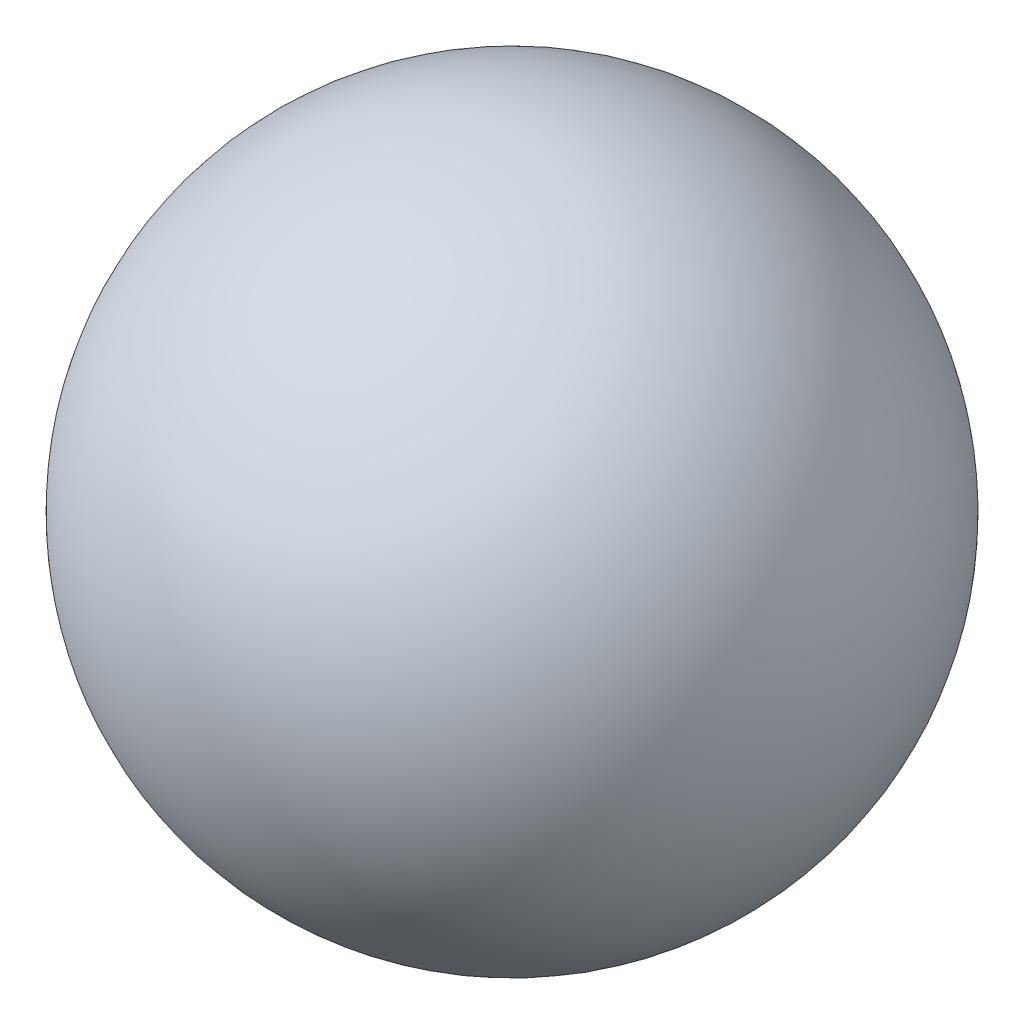
ISO-10303-21;
HEADER;
FILE_DESCRIPTION(('STEP AP214'),'2;1');
FILE_NAME('part.step','',(''),(''),'','','');
FILE_SCHEMA(('AUTOMOTIVE_DESIGN { 1 0 10303 214 1 1 1 1 }'));
ENDSEC;
DATA;
#1=APPLICATION_CONTEXT('core data for automotive mechanical design processes');
#2=APPLICATION_PROTOCOL_DEFINITION('international standard','automotive_design',2000,#1);
#3=PRODUCT_CONTEXT('',#1,'mechanical');
#4=PRODUCT('Part','Part','',(#3));
#5=PRODUCT_RELATED_PRODUCT_CATEGORY('part','',(#4));
#6=PRODUCT_DEFINITION_FORMATION('','',#4);
#7=PRODUCT_DEFINITION_CONTEXT('part definition',#1,'design');
#8=PRODUCT_DEFINITION('design','',#6,#7);
#9=PRODUCT_DEFINITION_SHAPE('','',#8);
#10=(LENGTH_UNIT() NAMED_UNIT(*) SI_UNIT(.MILLI.,.METRE.));
#11=(NAMED_UNIT(*) PLANE_ANGLE_UNIT() SI_UNIT($,.RADIAN.));
#12=(NAMED_UNIT(*) SI_UNIT($,.STERADIAN.) SOLID_ANGLE_UNIT());
#13=UNCERTAINTY_MEASURE_WITH_UNIT(LENGTH_MEASURE(1.E-05),#10,'distance_accuracy_value','');
#14=(GEOMETRIC_REPRESENTATION_CONTEXT(3) GLOBAL_UNCERTAINTY_ASSIGNED_CONTEXT((#13)) GLOBAL_UNIT_ASSIGNED_CONTEXT((#10,
#11,#12)) REPRESENTATION_CONTEXT('',''));
#15=CARTESIAN_POINT('',(0.,0.,0.));
#16=DIRECTION('',(0.,0.,1.));
#17=DIRECTION('',(1.,0.,0.));
#18=AXIS2_PLACEMENT_3D('',#15,#16,#17);
#19=CARTESIAN_POINT('',(3.4370383212695,1.98437499999999,0.));
#20=DIRECTION('',(0.86602540378444,0.499999999999998,0.));
#21=DIRECTION('',(-0.499999999999998,0.86602540378444,0.));
#22=AXIS2_PLACEMENT_3D('',#19,#20,#21);
#23=SPHERICAL_SURFACE('',#22,0.758760243513404);
#24=CARTESIAN_POINT('',(4.09414396753377,2.36375512175669,0.));
#25=VERTEX_POINT('',#24);
#26=VERTEX_LOOP('',#25);
#27=FACE_BOUND('',#26,.T.);
#28=ADVANCED_FACE('F34',(#27),#23,.T.);
#29=CLOSED_SHELL('',(#28));
#30=MANIFOLD_SOLID_BREP('B2',#29);
#31=ADVANCED_BREP_SHAPE_REPRESENTATION('',(#18,#30),#14);
#32=SHAPE_DEFINITION_REPRESENTATION(#9,#31);
ENDSEC;
END-ISO-10303-21;
